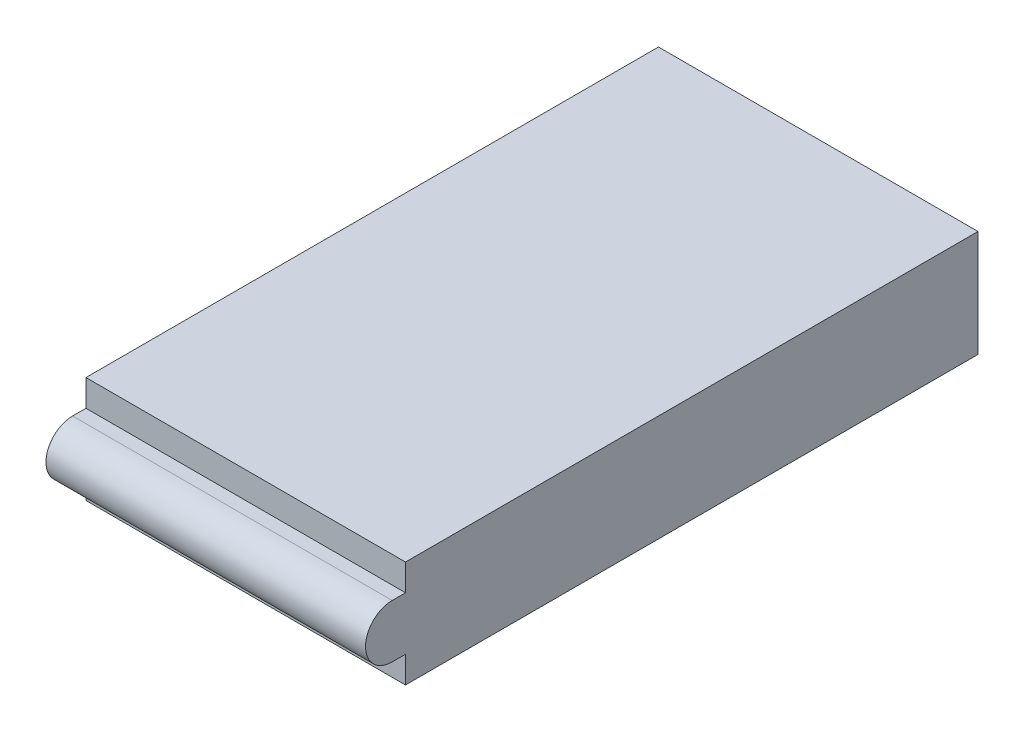
ISO-10303-21;
HEADER;
FILE_DESCRIPTION(('STEP AP214'),'2;1');
FILE_NAME('part.step','',(''),(''),'','','');
FILE_SCHEMA(('AUTOMOTIVE_DESIGN { 1 0 10303 214 1 1 1 1 }'));
ENDSEC;
DATA;
#1=APPLICATION_CONTEXT('core data for automotive mechanical design processes');
#2=APPLICATION_PROTOCOL_DEFINITION('international standard','automotive_design',2000,#1);
#3=PRODUCT_CONTEXT('',#1,'mechanical');
#4=PRODUCT('Part','Part','',(#3));
#5=PRODUCT_RELATED_PRODUCT_CATEGORY('part','',(#4));
#6=PRODUCT_DEFINITION_FORMATION('','',#4);
#7=PRODUCT_DEFINITION_CONTEXT('part definition',#1,'design');
#8=PRODUCT_DEFINITION('design','',#6,#7);
#9=PRODUCT_DEFINITION_SHAPE('','',#8);
#10=(LENGTH_UNIT() NAMED_UNIT(*) SI_UNIT(.MILLI.,.METRE.));
#11=(NAMED_UNIT(*) PLANE_ANGLE_UNIT() SI_UNIT($,.RADIAN.));
#12=(NAMED_UNIT(*) SI_UNIT($,.STERADIAN.) SOLID_ANGLE_UNIT());
#13=UNCERTAINTY_MEASURE_WITH_UNIT(LENGTH_MEASURE(1.E-05),#10,'distance_accuracy_value','');
#14=(GEOMETRIC_REPRESENTATION_CONTEXT(3) GLOBAL_UNCERTAINTY_ASSIGNED_CONTEXT((#13)) GLOBAL_UNIT_ASSIGNED_CONTEXT((#10,
#11,#12)) REPRESENTATION_CONTEXT('',''));
#15=CARTESIAN_POINT('',(0.,0.,0.));
#16=DIRECTION('',(0.,0.,1.));
#17=DIRECTION('',(1.,0.,0.));
#18=AXIS2_PLACEMENT_3D('',#15,#16,#17);
#19=CARTESIAN_POINT('',(0.,8.,0.));
#20=DIRECTION('',(0.,0.,-1.));
#21=DIRECTION('',(-1.,0.,0.));
#22=AXIS2_PLACEMENT_3D('',#19,#20,#21);
#23=PLANE('',#22);
#24=DIRECTION('',(0.,-1.,0.));
#25=VECTOR('',#24,1.);
#26=CARTESIAN_POINT('',(24.,8.,0.));
#27=LINE('',#26,#25);
#28=CARTESIAN_POINT('',(24.,2.,0.));
#29=VERTEX_POINT('',#28);
#30=CARTESIAN_POINT('',(24.,0.,0.));
#31=VERTEX_POINT('',#30);
#32=EDGE_CURVE('E60',#29,#31,#27,.T.);
#33=ORIENTED_EDGE('',*,*,#32,.F.);
#34=DIRECTION('',(1.,0.,0.));
#35=VECTOR('',#34,1.);
#36=CARTESIAN_POINT('',(-6.40312423743285,2.,0.));
#37=LINE('',#36,#35);
#38=CARTESIAN_POINT('',(0.,2.,0.));
#39=VERTEX_POINT('',#38);
#40=EDGE_CURVE('E136',#39,#29,#37,.T.);
#41=ORIENTED_EDGE('',*,*,#40,.F.);
#42=DIRECTION('',(0.,-1.,0.));
#43=VECTOR('',#42,1.);
#44=CARTESIAN_POINT('',(0.,8.,0.));
#45=LINE('',#44,#43);
#46=CARTESIAN_POINT('',(0.,0.,0.));
#47=VERTEX_POINT('',#46);
#48=EDGE_CURVE('E47',#39,#47,#45,.T.);
#49=ORIENTED_EDGE('',*,*,#48,.T.);
#50=DIRECTION('',(1.,0.,0.));
#51=VECTOR('',#50,1.);
#52=CARTESIAN_POINT('',(0.,0.,0.));
#53=LINE('',#52,#51);
#54=EDGE_CURVE('E156',#47,#31,#53,.T.);
#55=ORIENTED_EDGE('',*,*,#54,.T.);
#56=EDGE_LOOP('',(#33,#41,#49,#55));
#57=FACE_BOUND('',#56,.T.);
#58=ADVANCED_FACE('F39',(#57),#23,.F.);
#59=CARTESIAN_POINT('',(0.,8.,0.));
#60=DIRECTION('',(1.,0.,0.));
#61=DIRECTION('',(0.,0.,-1.));
#62=AXIS2_PLACEMENT_3D('',#59,#60,#61);
#63=PLANE('',#62);
#64=ORIENTED_EDGE('',*,*,#48,.F.);
#65=DIRECTION('',(0.,0.,1.));
#66=VECTOR('',#65,1.);
#67=CARTESIAN_POINT('',(0.,2.,0.));
#68=LINE('',#67,#66);
#69=CARTESIAN_POINT('',(0.,2.,0.999999999999999));
#70=VERTEX_POINT('',#69);
#71=EDGE_CURVE('E132',#39,#70,#68,.T.);
#72=ORIENTED_EDGE('',*,*,#71,.T.);
#73=CARTESIAN_POINT('',(0.,4.,1.));
#74=DIRECTION('',(1.,0.,0.));
#75=DIRECTION('',(0.,0.,-1.));
#76=AXIS2_PLACEMENT_3D('',#73,#74,#75);
#77=CIRCLE('',#76,2.);
#78=CARTESIAN_POINT('',(0.,6.,0.999999999999999));
#79=VERTEX_POINT('',#78);
#80=EDGE_CURVE('E138',#70,#79,#77,.F.);
#81=ORIENTED_EDGE('',*,*,#80,.T.);
#82=DIRECTION('',(0.,0.,-1.));
#83=VECTOR('',#82,1.);
#84=CARTESIAN_POINT('',(0.,6.,0.));
#85=LINE('',#84,#83);
#86=CARTESIAN_POINT('',(0.,6.,0.));
#87=VERTEX_POINT('',#86);
#88=EDGE_CURVE('E110',#79,#87,#85,.T.);
#89=ORIENTED_EDGE('',*,*,#88,.T.);
#90=CARTESIAN_POINT('',(0.,8.,0.));
#91=VERTEX_POINT('',#90);
#92=EDGE_CURVE('E11',#91,#87,#45,.T.);
#93=ORIENTED_EDGE('',*,*,#92,.F.);
#94=DIRECTION('',(0.,0.,1.));
#95=VECTOR('',#94,1.);
#96=CARTESIAN_POINT('',(0.,8.,0.));
#97=LINE('',#96,#95);
#98=CARTESIAN_POINT('',(0.,8.,-43.));
#99=VERTEX_POINT('',#98);
#100=EDGE_CURVE('E143',#99,#91,#97,.T.);
#101=ORIENTED_EDGE('',*,*,#100,.F.);
#102=DIRECTION('',(0.,-1.,0.));
#103=VECTOR('',#102,1.);
#104=CARTESIAN_POINT('',(0.,8.,-43.));
#105=LINE('',#104,#103);
#106=CARTESIAN_POINT('',(0.,0.,-43.));
#107=VERTEX_POINT('',#106);
#108=EDGE_CURVE('E153',#99,#107,#105,.T.);
#109=ORIENTED_EDGE('',*,*,#108,.T.);
#110=DIRECTION('',(0.,0.,1.));
#111=VECTOR('',#110,1.);
#112=CARTESIAN_POINT('',(0.,0.,0.));
#113=LINE('',#112,#111);
#114=EDGE_CURVE('E142',#107,#47,#113,.T.);
#115=ORIENTED_EDGE('',*,*,#114,.T.);
#116=EDGE_LOOP('',(#64,#72,#81,#89,#93,#101,#109,#115));
#117=FACE_BOUND('',#116,.T.);
#118=ADVANCED_FACE('F41',(#117),#63,.F.);
#119=ORIENTED_EDGE('',*,*,#92,.T.);
#120=DIRECTION('',(1.,0.,0.));
#121=VECTOR('',#120,1.);
#122=CARTESIAN_POINT('',(-6.40312423743285,6.,0.));
#123=LINE('',#122,#121);
#124=CARTESIAN_POINT('',(24.,6.,0.));
#125=VERTEX_POINT('',#124);
#126=EDGE_CURVE('E114',#87,#125,#123,.T.);
#127=ORIENTED_EDGE('',*,*,#126,.T.);
#128=CARTESIAN_POINT('',(24.,8.,0.));
#129=VERTEX_POINT('',#128);
#130=EDGE_CURVE('E129',#129,#125,#27,.T.);
#131=ORIENTED_EDGE('',*,*,#130,.F.);
#132=DIRECTION('',(1.,0.,0.));
#133=VECTOR('',#132,1.);
#134=CARTESIAN_POINT('',(0.,8.,0.));
#135=LINE('',#134,#133);
#136=EDGE_CURVE('E146',#91,#129,#135,.T.);
#137=ORIENTED_EDGE('',*,*,#136,.F.);
#138=EDGE_LOOP('',(#119,#127,#131,#137));
#139=FACE_BOUND('',#138,.T.);
#140=ADVANCED_FACE('F180',(#139),#23,.F.);
#141=CARTESIAN_POINT('',(24.,8.,0.));
#142=DIRECTION('',(-1.,0.,0.));
#143=DIRECTION('',(0.,0.,1.));
#144=AXIS2_PLACEMENT_3D('',#141,#142,#143);
#145=PLANE('',#144);
#146=ORIENTED_EDGE('',*,*,#130,.T.);
#147=DIRECTION('',(0.,0.,1.));
#148=VECTOR('',#147,1.);
#149=CARTESIAN_POINT('',(24.,6.,0.));
#150=LINE('',#149,#148);
#151=CARTESIAN_POINT('',(24.,6.,0.999999999999999));
#152=VERTEX_POINT('',#151);
#153=EDGE_CURVE('E109',#125,#152,#150,.T.);
#154=ORIENTED_EDGE('',*,*,#153,.T.);
#155=CARTESIAN_POINT('',(24.,4.,1.));
#156=DIRECTION('',(1.,0.,0.));
#157=DIRECTION('',(0.,0.,-1.));
#158=AXIS2_PLACEMENT_3D('',#155,#156,#157);
#159=CIRCLE('',#158,2.);
#160=CARTESIAN_POINT('',(24.,2.,0.999999999999999));
#161=VERTEX_POINT('',#160);
#162=EDGE_CURVE('E117',#152,#161,#159,.T.);
#163=ORIENTED_EDGE('',*,*,#162,.T.);
#164=DIRECTION('',(0.,0.,-1.));
#165=VECTOR('',#164,1.);
#166=CARTESIAN_POINT('',(24.,2.,0.));
#167=LINE('',#166,#165);
#168=EDGE_CURVE('E123',#161,#29,#167,.T.);
#169=ORIENTED_EDGE('',*,*,#168,.T.);
#170=ORIENTED_EDGE('',*,*,#32,.T.);
#171=DIRECTION('',(0.,0.,-1.));
#172=VECTOR('',#171,1.);
#173=CARTESIAN_POINT('',(24.,0.,0.));
#174=LINE('',#173,#172);
#175=CARTESIAN_POINT('',(24.,0.,-43.));
#176=VERTEX_POINT('',#175);
#177=EDGE_CURVE('E158',#31,#176,#174,.T.);
#178=ORIENTED_EDGE('',*,*,#177,.T.);
#179=DIRECTION('',(0.,-1.,0.));
#180=VECTOR('',#179,1.);
#181=CARTESIAN_POINT('',(24.,8.,-43.));
#182=LINE('',#181,#180);
#183=CARTESIAN_POINT('',(24.,8.,-43.));
#184=VERTEX_POINT('',#183);
#185=EDGE_CURVE('E163',#184,#176,#182,.T.);
#186=ORIENTED_EDGE('',*,*,#185,.F.);
#187=DIRECTION('',(0.,0.,-1.));
#188=VECTOR('',#187,1.);
#189=CARTESIAN_POINT('',(24.,8.,0.));
#190=LINE('',#189,#188);
#191=EDGE_CURVE('E149',#129,#184,#190,.T.);
#192=ORIENTED_EDGE('',*,*,#191,.F.);
#193=EDGE_LOOP('',(#146,#154,#163,#169,#170,#178,#186,#192));
#194=FACE_BOUND('',#193,.T.);
#195=ADVANCED_FACE('F126',(#194),#145,.F.);
#196=CARTESIAN_POINT('',(0.,8.,-43.));
#197=DIRECTION('',(0.,0.,1.));
#198=DIRECTION('',(1.,0.,0.));
#199=AXIS2_PLACEMENT_3D('',#196,#197,#198);
#200=PLANE('',#199);
#201=DIRECTION('',(-1.,0.,0.));
#202=VECTOR('',#201,1.);
#203=CARTESIAN_POINT('',(0.,0.,-43.));
#204=LINE('',#203,#202);
#205=EDGE_CURVE('E147',#176,#107,#204,.T.);
#206=ORIENTED_EDGE('',*,*,#205,.T.);
#207=ORIENTED_EDGE('',*,*,#108,.F.);
#208=DIRECTION('',(-1.,0.,0.));
#209=VECTOR('',#208,1.);
#210=CARTESIAN_POINT('',(0.,8.,-43.));
#211=LINE('',#210,#209);
#212=EDGE_CURVE('E151',#184,#99,#211,.T.);
#213=ORIENTED_EDGE('',*,*,#212,.F.);
#214=ORIENTED_EDGE('',*,*,#185,.T.);
#215=EDGE_LOOP('',(#206,#207,#213,#214));
#216=FACE_BOUND('',#215,.T.);
#217=ADVANCED_FACE('F174',(#216),#200,.F.);
#218=CARTESIAN_POINT('',(0.,8.,0.));
#219=DIRECTION('',(0.,-1.,0.));
#220=DIRECTION('',(0.,0.,-1.));
#221=AXIS2_PLACEMENT_3D('',#218,#219,#220);
#222=PLANE('',#221);
#223=ORIENTED_EDGE('',*,*,#100,.T.);
#224=ORIENTED_EDGE('',*,*,#136,.T.);
#225=ORIENTED_EDGE('',*,*,#191,.T.);
#226=ORIENTED_EDGE('',*,*,#212,.T.);
#227=EDGE_LOOP('',(#223,#224,#225,#226));
#228=FACE_BOUND('',#227,.T.);
#229=ADVANCED_FACE('F179',(#228),#222,.F.);
#230=CARTESIAN_POINT('',(0.,0.,0.));
#231=DIRECTION('',(0.,-1.,0.));
#232=DIRECTION('',(0.,0.,-1.));
#233=AXIS2_PLACEMENT_3D('',#230,#231,#232);
#234=PLANE('',#233);
#235=ORIENTED_EDGE('',*,*,#114,.F.);
#236=ORIENTED_EDGE('',*,*,#205,.F.);
#237=ORIENTED_EDGE('',*,*,#177,.F.);
#238=ORIENTED_EDGE('',*,*,#54,.F.);
#239=EDGE_LOOP('',(#235,#236,#237,#238));
#240=FACE_BOUND('',#239,.T.);
#241=ADVANCED_FACE('F171',(#240),#234,.T.);
#242=CARTESIAN_POINT('',(-6.40312423743285,2.,0.));
#243=DIRECTION('',(0.,-1.,0.));
#244=DIRECTION('',(0.,0.,-1.));
#245=AXIS2_PLACEMENT_3D('',#242,#243,#244);
#246=PLANE('',#245);
#247=ORIENTED_EDGE('',*,*,#71,.F.);
#248=ORIENTED_EDGE('',*,*,#40,.T.);
#249=ORIENTED_EDGE('',*,*,#168,.F.);
#250=DIRECTION('',(1.,0.,0.));
#251=VECTOR('',#250,1.);
#252=CARTESIAN_POINT('',(-6.40312423743285,2.,0.999999999999999));
#253=LINE('',#252,#251);
#254=EDGE_CURVE('E113',#70,#161,#253,.T.);
#255=ORIENTED_EDGE('',*,*,#254,.F.);
#256=EDGE_LOOP('',(#247,#248,#249,#255));
#257=FACE_BOUND('',#256,.T.);
#258=ADVANCED_FACE('F216',(#257),#246,.T.);
#259=CARTESIAN_POINT('',(-6.40312423743285,4.,1.));
#260=DIRECTION('',(1.,0.,0.));
#261=DIRECTION('',(0.,0.,-1.));
#262=AXIS2_PLACEMENT_3D('',#259,#260,#261);
#263=CYLINDRICAL_SURFACE('',#262,2.);
#264=ORIENTED_EDGE('',*,*,#80,.F.);
#265=ORIENTED_EDGE('',*,*,#254,.T.);
#266=ORIENTED_EDGE('',*,*,#162,.F.);
#267=DIRECTION('',(1.,0.,0.));
#268=VECTOR('',#267,1.);
#269=CARTESIAN_POINT('',(-6.40312423743285,6.,0.999999999999999));
#270=LINE('',#269,#268);
#271=EDGE_CURVE('E104',#79,#152,#270,.T.);
#272=ORIENTED_EDGE('',*,*,#271,.F.);
#273=EDGE_LOOP('',(#264,#265,#266,#272));
#274=FACE_BOUND('',#273,.T.);
#275=ADVANCED_FACE('F118',(#274),#263,.T.);
#276=CARTESIAN_POINT('',(-6.40312423743285,6.,0.));
#277=DIRECTION('',(0.,1.,0.));
#278=DIRECTION('',(0.,0.,1.));
#279=AXIS2_PLACEMENT_3D('',#276,#277,#278);
#280=PLANE('',#279);
#281=ORIENTED_EDGE('',*,*,#88,.F.);
#282=ORIENTED_EDGE('',*,*,#271,.T.);
#283=ORIENTED_EDGE('',*,*,#153,.F.);
#284=ORIENTED_EDGE('',*,*,#126,.F.);
#285=EDGE_LOOP('',(#281,#282,#283,#284));
#286=FACE_BOUND('',#285,.T.);
#287=ADVANCED_FACE('F106',(#286),#280,.T.);
#288=CLOSED_SHELL('',(#58,#118,#140,#195,#217,#229,#241,#258,#275,#287));
#289=MANIFOLD_SOLID_BREP('B2',#288);
#290=ADVANCED_BREP_SHAPE_REPRESENTATION('',(#18,#289),#14);
#291=SHAPE_DEFINITION_REPRESENTATION(#9,#290);
ENDSEC;
END-ISO-10303-21;
